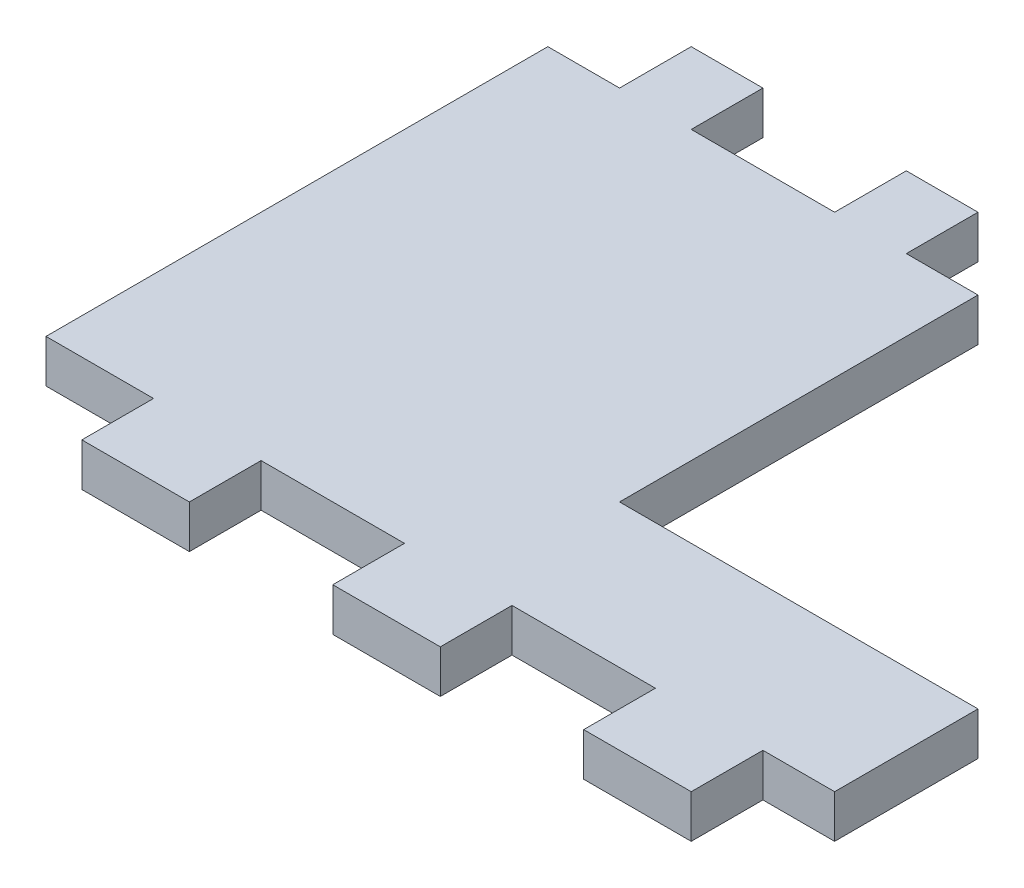
ISO-10303-21;
HEADER;
FILE_DESCRIPTION(('STEP AP214'),'2;1');
FILE_NAME('part.step','',(''),(''),'','','');
FILE_SCHEMA(('AUTOMOTIVE_DESIGN { 1 0 10303 214 1 1 1 1 }'));
ENDSEC;
DATA;
#1=APPLICATION_CONTEXT('core data for automotive mechanical design processes');
#2=APPLICATION_PROTOCOL_DEFINITION('international standard','automotive_design',2000,#1);
#3=PRODUCT_CONTEXT('',#1,'mechanical');
#4=PRODUCT('Part','Part','',(#3));
#5=PRODUCT_RELATED_PRODUCT_CATEGORY('part','',(#4));
#6=PRODUCT_DEFINITION_FORMATION('','',#4);
#7=PRODUCT_DEFINITION_CONTEXT('part definition',#1,'design');
#8=PRODUCT_DEFINITION('design','',#6,#7);
#9=PRODUCT_DEFINITION_SHAPE('','',#8);
#10=(LENGTH_UNIT() NAMED_UNIT(*) SI_UNIT(.MILLI.,.METRE.));
#11=(NAMED_UNIT(*) PLANE_ANGLE_UNIT() SI_UNIT($,.RADIAN.));
#12=(NAMED_UNIT(*) SI_UNIT($,.STERADIAN.) SOLID_ANGLE_UNIT());
#13=UNCERTAINTY_MEASURE_WITH_UNIT(LENGTH_MEASURE(1.E-05),#10,'distance_accuracy_value','');
#14=(GEOMETRIC_REPRESENTATION_CONTEXT(3) GLOBAL_UNCERTAINTY_ASSIGNED_CONTEXT((#13)) GLOBAL_UNIT_ASSIGNED_CONTEXT((#10,
#11,#12)) REPRESENTATION_CONTEXT('',''));
#15=CARTESIAN_POINT('',(0.,0.,0.));
#16=DIRECTION('',(0.,0.,1.));
#17=DIRECTION('',(1.,0.,0.));
#18=AXIS2_PLACEMENT_3D('',#15,#16,#17);
#19=CARTESIAN_POINT('',(-48.4605767520481,3.,-3.11327042125784));
#20=DIRECTION('',(-1.,0.,0.));
#21=DIRECTION('',(0.,0.,1.));
#22=AXIS2_PLACEMENT_3D('',#19,#20,#21);
#23=PLANE('',#22);
#24=DIRECTION('',(0.,0.,-1.));
#25=VECTOR('',#24,1.);
#26=CARTESIAN_POINT('',(-48.4605767520481,0.,-3.11327042125784));
#27=LINE('',#26,#25);
#28=CARTESIAN_POINT('',(-48.4605767520481,0.,1.88672957874216));
#29=VERTEX_POINT('',#28);
#30=CARTESIAN_POINT('',(-48.4605767520481,0.,-3.11327042125784));
#31=VERTEX_POINT('',#30);
#32=EDGE_CURVE('E238',#29,#31,#27,.T.);
#33=ORIENTED_EDGE('',*,*,#32,.T.);
#34=DIRECTION('',(0.,-1.,0.));
#35=VECTOR('',#34,1.);
#36=CARTESIAN_POINT('',(-48.4605767520481,3.,-3.11327042125784));
#37=LINE('',#36,#35);
#38=CARTESIAN_POINT('',(-48.4605767520481,3.,-3.11327042125784));
#39=VERTEX_POINT('',#38);
#40=EDGE_CURVE('E11',#39,#31,#37,.T.);
#41=ORIENTED_EDGE('',*,*,#40,.F.);
#42=DIRECTION('',(0.,0.,-1.));
#43=VECTOR('',#42,1.);
#44=CARTESIAN_POINT('',(-48.4605767520481,3.,-3.11327042125784));
#45=LINE('',#44,#43);
#46=CARTESIAN_POINT('',(-48.4605767520481,3.,1.88672957874216));
#47=VERTEX_POINT('',#46);
#48=EDGE_CURVE('E288',#47,#39,#45,.T.);
#49=ORIENTED_EDGE('',*,*,#48,.F.);
#50=DIRECTION('',(0.,-1.,0.));
#51=VECTOR('',#50,1.);
#52=CARTESIAN_POINT('',(-48.4605767520481,3.,1.88672957874216));
#53=LINE('',#52,#51);
#54=EDGE_CURVE('E234',#47,#29,#53,.T.);
#55=ORIENTED_EDGE('',*,*,#54,.T.);
#56=EDGE_LOOP('',(#33,#41,#49,#55));
#57=FACE_BOUND('',#56,.T.);
#58=ADVANCED_FACE('F34',(#57),#23,.F.);
#59=CARTESIAN_POINT('',(-48.4605767520481,3.,-3.11327042125784));
#60=DIRECTION('',(0.,0.,1.));
#61=DIRECTION('',(1.,0.,0.));
#62=AXIS2_PLACEMENT_3D('',#59,#60,#61);
#63=PLANE('',#62);
#64=DIRECTION('',(-1.,0.,0.));
#65=VECTOR('',#64,1.);
#66=CARTESIAN_POINT('',(-48.4605767520481,0.,-3.11327042125784));
#67=LINE('',#66,#65);
#68=CARTESIAN_POINT('',(-53.4605767520481,0.,-3.11327042125783));
#69=VERTEX_POINT('',#68);
#70=EDGE_CURVE('E241',#31,#69,#67,.T.);
#71=ORIENTED_EDGE('',*,*,#70,.T.);
#72=DIRECTION('',(0.,-1.,0.));
#73=VECTOR('',#72,1.);
#74=CARTESIAN_POINT('',(-53.4605767520481,3.,-3.11327042125783));
#75=LINE('',#74,#73);
#76=CARTESIAN_POINT('',(-53.4605767520481,3.,-3.11327042125783));
#77=VERTEX_POINT('',#76);
#78=EDGE_CURVE('E42',#77,#69,#75,.T.);
#79=ORIENTED_EDGE('',*,*,#78,.F.);
#80=DIRECTION('',(-1.,0.,0.));
#81=VECTOR('',#80,1.);
#82=CARTESIAN_POINT('',(-48.4605767520481,3.,-3.11327042125784));
#83=LINE('',#82,#81);
#84=EDGE_CURVE('E147',#39,#77,#83,.T.);
#85=ORIENTED_EDGE('',*,*,#84,.F.);
#86=ORIENTED_EDGE('',*,*,#40,.T.);
#87=EDGE_LOOP('',(#71,#79,#85,#86));
#88=FACE_BOUND('',#87,.T.);
#89=ADVANCED_FACE('F436',(#88),#63,.F.);
#90=CARTESIAN_POINT('',(-53.4605767520481,3.,1.88672957874217));
#91=DIRECTION('',(1.,0.,0.));
#92=DIRECTION('',(0.,0.,-1.));
#93=AXIS2_PLACEMENT_3D('',#90,#91,#92);
#94=PLANE('',#93);
#95=DIRECTION('',(0.,0.,1.));
#96=VECTOR('',#95,1.);
#97=CARTESIAN_POINT('',(-53.4605767520481,0.,1.88672957874217));
#98=LINE('',#97,#96);
#99=CARTESIAN_POINT('',(-53.4605767520481,0.,1.88672957874217));
#100=VERTEX_POINT('',#99);
#101=EDGE_CURVE('E243',#69,#100,#98,.T.);
#102=ORIENTED_EDGE('',*,*,#101,.T.);
#103=DIRECTION('',(0.,-1.,0.));
#104=VECTOR('',#103,1.);
#105=CARTESIAN_POINT('',(-53.4605767520481,3.,1.88672957874217));
#106=LINE('',#105,#104);
#107=CARTESIAN_POINT('',(-53.4605767520481,3.,1.88672957874217));
#108=VERTEX_POINT('',#107);
#109=EDGE_CURVE('E349',#108,#100,#106,.T.);
#110=ORIENTED_EDGE('',*,*,#109,.F.);
#111=DIRECTION('',(0.,0.,1.));
#112=VECTOR('',#111,1.);
#113=CARTESIAN_POINT('',(-53.4605767520481,3.,1.88672957874217));
#114=LINE('',#113,#112);
#115=EDGE_CURVE('E357',#77,#108,#114,.T.);
#116=ORIENTED_EDGE('',*,*,#115,.F.);
#117=ORIENTED_EDGE('',*,*,#78,.T.);
#118=EDGE_LOOP('',(#102,#110,#116,#117));
#119=FACE_BOUND('',#118,.T.);
#120=ADVANCED_FACE('F355',(#119),#94,.F.);
#121=CARTESIAN_POINT('',(-63.4605767520481,3.,1.88672957874217));
#122=DIRECTION('',(0.,0.,1.));
#123=DIRECTION('',(1.,0.,0.));
#124=AXIS2_PLACEMENT_3D('',#121,#122,#123);
#125=PLANE('',#124);
#126=DIRECTION('',(-1.,0.,0.));
#127=VECTOR('',#126,1.);
#128=CARTESIAN_POINT('',(-63.4605767520481,0.,1.88672957874217));
#129=LINE('',#128,#127);
#130=CARTESIAN_POINT('',(-63.4605767520481,0.,1.88672957874217));
#131=VERTEX_POINT('',#130);
#132=EDGE_CURVE('E245',#100,#131,#129,.T.);
#133=ORIENTED_EDGE('',*,*,#132,.T.);
#134=DIRECTION('',(0.,-1.,0.));
#135=VECTOR('',#134,1.);
#136=CARTESIAN_POINT('',(-63.4605767520481,3.,1.88672957874217));
#137=LINE('',#136,#135);
#138=CARTESIAN_POINT('',(-63.4605767520481,3.,1.88672957874217));
#139=VERTEX_POINT('',#138);
#140=EDGE_CURVE('E346',#139,#131,#137,.T.);
#141=ORIENTED_EDGE('',*,*,#140,.F.);
#142=DIRECTION('',(-1.,0.,0.));
#143=VECTOR('',#142,1.);
#144=CARTESIAN_POINT('',(-63.4605767520481,3.,1.88672957874217));
#145=LINE('',#144,#143);
#146=EDGE_CURVE('E375',#108,#139,#145,.T.);
#147=ORIENTED_EDGE('',*,*,#146,.F.);
#148=ORIENTED_EDGE('',*,*,#109,.T.);
#149=EDGE_LOOP('',(#133,#141,#147,#148));
#150=FACE_BOUND('',#149,.T.);
#151=ADVANCED_FACE('F366',(#150),#125,.F.);
#152=CARTESIAN_POINT('',(-63.4605767520481,3.,-3.11327042125783));
#153=DIRECTION('',(-1.,0.,0.));
#154=DIRECTION('',(0.,0.,1.));
#155=AXIS2_PLACEMENT_3D('',#152,#153,#154);
#156=PLANE('',#155);
#157=DIRECTION('',(0.,0.,-1.));
#158=VECTOR('',#157,1.);
#159=CARTESIAN_POINT('',(-63.4605767520481,0.,-3.11327042125783));
#160=LINE('',#159,#158);
#161=CARTESIAN_POINT('',(-63.4605767520481,0.,-3.11327042125783));
#162=VERTEX_POINT('',#161);
#163=EDGE_CURVE('E247',#131,#162,#160,.T.);
#164=ORIENTED_EDGE('',*,*,#163,.T.);
#165=DIRECTION('',(0.,-1.,0.));
#166=VECTOR('',#165,1.);
#167=CARTESIAN_POINT('',(-63.4605767520481,3.,-3.11327042125783));
#168=LINE('',#167,#166);
#169=CARTESIAN_POINT('',(-63.4605767520481,3.,-3.11327042125783));
#170=VERTEX_POINT('',#169);
#171=EDGE_CURVE('E343',#170,#162,#168,.T.);
#172=ORIENTED_EDGE('',*,*,#171,.F.);
#173=DIRECTION('',(0.,0.,-1.));
#174=VECTOR('',#173,1.);
#175=CARTESIAN_POINT('',(-63.4605767520481,3.,-3.11327042125783));
#176=LINE('',#175,#174);
#177=EDGE_CURVE('E372',#139,#170,#176,.T.);
#178=ORIENTED_EDGE('',*,*,#177,.F.);
#179=ORIENTED_EDGE('',*,*,#140,.T.);
#180=EDGE_LOOP('',(#164,#172,#178,#179));
#181=FACE_BOUND('',#180,.T.);
#182=ADVANCED_FACE('F370',(#181),#156,.F.);
#183=CARTESIAN_POINT('',(-68.4605767520481,3.,-3.11327042125783));
#184=DIRECTION('',(0.,0.,1.));
#185=DIRECTION('',(1.,0.,0.));
#186=AXIS2_PLACEMENT_3D('',#183,#184,#185);
#187=PLANE('',#186);
#188=DIRECTION('',(-1.,0.,0.));
#189=VECTOR('',#188,1.);
#190=CARTESIAN_POINT('',(-68.4605767520481,0.,-3.11327042125783));
#191=LINE('',#190,#189);
#192=CARTESIAN_POINT('',(-68.4605767520481,0.,-3.11327042125783));
#193=VERTEX_POINT('',#192);
#194=EDGE_CURVE('E249',#162,#193,#191,.T.);
#195=ORIENTED_EDGE('',*,*,#194,.T.);
#196=DIRECTION('',(0.,-1.,0.));
#197=VECTOR('',#196,1.);
#198=CARTESIAN_POINT('',(-68.4605767520481,3.,-3.11327042125783));
#199=LINE('',#198,#197);
#200=CARTESIAN_POINT('',(-68.4605767520481,3.,-3.11327042125783));
#201=VERTEX_POINT('',#200);
#202=EDGE_CURVE('E340',#201,#193,#199,.T.);
#203=ORIENTED_EDGE('',*,*,#202,.F.);
#204=DIRECTION('',(-1.,0.,0.));
#205=VECTOR('',#204,1.);
#206=CARTESIAN_POINT('',(-68.4605767520481,3.,-3.11327042125783));
#207=LINE('',#206,#205);
#208=EDGE_CURVE('E374',#170,#201,#207,.T.);
#209=ORIENTED_EDGE('',*,*,#208,.F.);
#210=ORIENTED_EDGE('',*,*,#171,.T.);
#211=EDGE_LOOP('',(#195,#203,#209,#210));
#212=FACE_BOUND('',#211,.T.);
#213=ADVANCED_FACE('F449',(#212),#187,.F.);
#214=CARTESIAN_POINT('',(-68.4605767520481,3.,1.88672957874216));
#215=DIRECTION('',(1.,0.,0.));
#216=DIRECTION('',(0.,0.,-1.));
#217=AXIS2_PLACEMENT_3D('',#214,#215,#216);
#218=PLANE('',#217);
#219=DIRECTION('',(0.,0.,1.));
#220=VECTOR('',#219,1.);
#221=CARTESIAN_POINT('',(-68.4605767520481,0.,1.88672957874216));
#222=LINE('',#221,#220);
#223=CARTESIAN_POINT('',(-68.4605767520481,0.,1.88672957874216));
#224=VERTEX_POINT('',#223);
#225=EDGE_CURVE('E251',#193,#224,#222,.T.);
#226=ORIENTED_EDGE('',*,*,#225,.T.);
#227=DIRECTION('',(0.,-1.,0.));
#228=VECTOR('',#227,1.);
#229=CARTESIAN_POINT('',(-68.4605767520481,3.,1.88672957874216));
#230=LINE('',#229,#228);
#231=CARTESIAN_POINT('',(-68.4605767520481,3.,1.88672957874216));
#232=VERTEX_POINT('',#231);
#233=EDGE_CURVE('E337',#232,#224,#230,.T.);
#234=ORIENTED_EDGE('',*,*,#233,.F.);
#235=DIRECTION('',(0.,0.,1.));
#236=VECTOR('',#235,1.);
#237=CARTESIAN_POINT('',(-68.4605767520481,3.,1.88672957874216));
#238=LINE('',#237,#236);
#239=EDGE_CURVE('E377',#201,#232,#238,.T.);
#240=ORIENTED_EDGE('',*,*,#239,.F.);
#241=ORIENTED_EDGE('',*,*,#202,.T.);
#242=EDGE_LOOP('',(#226,#234,#240,#241));
#243=FACE_BOUND('',#242,.T.);
#244=ADVANCED_FACE('F452',(#243),#218,.F.);
#245=CARTESIAN_POINT('',(-68.4605767520481,3.,1.88672957874216));
#246=DIRECTION('',(0.,0.,1.));
#247=DIRECTION('',(1.,0.,0.));
#248=AXIS2_PLACEMENT_3D('',#245,#246,#247);
#249=PLANE('',#248);
#250=DIRECTION('',(-1.,0.,0.));
#251=VECTOR('',#250,1.);
#252=CARTESIAN_POINT('',(-68.4605767520481,0.,1.88672957874216));
#253=LINE('',#252,#251);
#254=CARTESIAN_POINT('',(-73.4605767520481,0.,1.88672957874216));
#255=VERTEX_POINT('',#254);
#256=EDGE_CURVE('E253',#224,#255,#253,.T.);
#257=ORIENTED_EDGE('',*,*,#256,.T.);
#258=DIRECTION('',(0.,-1.,0.));
#259=VECTOR('',#258,1.);
#260=CARTESIAN_POINT('',(-73.4605767520481,3.,1.88672957874216));
#261=LINE('',#260,#259);
#262=CARTESIAN_POINT('',(-73.4605767520481,3.,1.88672957874216));
#263=VERTEX_POINT('',#262);
#264=EDGE_CURVE('E334',#263,#255,#261,.T.);
#265=ORIENTED_EDGE('',*,*,#264,.F.);
#266=DIRECTION('',(-1.,0.,0.));
#267=VECTOR('',#266,1.);
#268=CARTESIAN_POINT('',(-68.4605767520481,3.,1.88672957874216));
#269=LINE('',#268,#267);
#270=EDGE_CURVE('E383',#232,#263,#269,.T.);
#271=ORIENTED_EDGE('',*,*,#270,.F.);
#272=ORIENTED_EDGE('',*,*,#233,.T.);
#273=EDGE_LOOP('',(#257,#265,#271,#272));
#274=FACE_BOUND('',#273,.T.);
#275=ADVANCED_FACE('F456',(#274),#249,.F.);
#276=CARTESIAN_POINT('',(-73.4605767520481,3.,36.8867295787422));
#277=DIRECTION('',(1.,0.,0.));
#278=DIRECTION('',(0.,0.,-1.));
#279=AXIS2_PLACEMENT_3D('',#276,#277,#278);
#280=PLANE('',#279);
#281=DIRECTION('',(0.,0.,1.));
#282=VECTOR('',#281,1.);
#283=CARTESIAN_POINT('',(-73.4605767520481,0.,36.8867295787422));
#284=LINE('',#283,#282);
#285=CARTESIAN_POINT('',(-73.4605767520481,0.,36.8867295787422));
#286=VERTEX_POINT('',#285);
#287=EDGE_CURVE('E255',#255,#286,#284,.T.);
#288=ORIENTED_EDGE('',*,*,#287,.T.);
#289=DIRECTION('',(0.,-1.,0.));
#290=VECTOR('',#289,1.);
#291=CARTESIAN_POINT('',(-73.4605767520481,3.,36.8867295787422));
#292=LINE('',#291,#290);
#293=CARTESIAN_POINT('',(-73.4605767520481,3.,36.8867295787422));
#294=VERTEX_POINT('',#293);
#295=EDGE_CURVE('E331',#294,#286,#292,.T.);
#296=ORIENTED_EDGE('',*,*,#295,.F.);
#297=DIRECTION('',(0.,0.,1.));
#298=VECTOR('',#297,1.);
#299=CARTESIAN_POINT('',(-73.4605767520481,3.,36.8867295787422));
#300=LINE('',#299,#298);
#301=EDGE_CURVE('E385',#263,#294,#300,.T.);
#302=ORIENTED_EDGE('',*,*,#301,.F.);
#303=ORIENTED_EDGE('',*,*,#264,.T.);
#304=EDGE_LOOP('',(#288,#296,#302,#303));
#305=FACE_BOUND('',#304,.T.);
#306=ADVANCED_FACE('F460',(#305),#280,.F.);
#307=CARTESIAN_POINT('',(-65.9605767520481,3.,36.8867295787422));
#308=DIRECTION('',(0.,0.,-1.));
#309=DIRECTION('',(-1.,0.,0.));
#310=AXIS2_PLACEMENT_3D('',#307,#308,#309);
#311=PLANE('',#310);
#312=DIRECTION('',(1.,0.,0.));
#313=VECTOR('',#312,1.);
#314=CARTESIAN_POINT('',(-65.9605767520481,0.,36.8867295787422));
#315=LINE('',#314,#313);
#316=CARTESIAN_POINT('',(-65.9605767520481,0.,36.8867295787422));
#317=VERTEX_POINT('',#316);
#318=EDGE_CURVE('E257',#286,#317,#315,.T.);
#319=ORIENTED_EDGE('',*,*,#318,.T.);
#320=DIRECTION('',(0.,-1.,0.));
#321=VECTOR('',#320,1.);
#322=CARTESIAN_POINT('',(-65.9605767520481,3.,36.8867295787422));
#323=LINE('',#322,#321);
#324=CARTESIAN_POINT('',(-65.9605767520481,3.,36.8867295787422));
#325=VERTEX_POINT('',#324);
#326=EDGE_CURVE('E328',#325,#317,#323,.T.);
#327=ORIENTED_EDGE('',*,*,#326,.F.);
#328=DIRECTION('',(1.,0.,0.));
#329=VECTOR('',#328,1.);
#330=CARTESIAN_POINT('',(-65.9605767520481,3.,36.8867295787422));
#331=LINE('',#330,#329);
#332=EDGE_CURVE('E387',#294,#325,#331,.T.);
#333=ORIENTED_EDGE('',*,*,#332,.F.);
#334=ORIENTED_EDGE('',*,*,#295,.T.);
#335=EDGE_LOOP('',(#319,#327,#333,#334));
#336=FACE_BOUND('',#335,.T.);
#337=ADVANCED_FACE('F464',(#336),#311,.F.);
#338=CARTESIAN_POINT('',(-65.9605767520481,3.,41.8867295787422));
#339=DIRECTION('',(1.,0.,0.));
#340=DIRECTION('',(0.,0.,-1.));
#341=AXIS2_PLACEMENT_3D('',#338,#339,#340);
#342=PLANE('',#341);
#343=DIRECTION('',(0.,0.,1.));
#344=VECTOR('',#343,1.);
#345=CARTESIAN_POINT('',(-65.9605767520481,0.,41.8867295787422));
#346=LINE('',#345,#344);
#347=CARTESIAN_POINT('',(-65.9605767520481,0.,41.8867295787422));
#348=VERTEX_POINT('',#347);
#349=EDGE_CURVE('E259',#317,#348,#346,.T.);
#350=ORIENTED_EDGE('',*,*,#349,.T.);
#351=DIRECTION('',(0.,-1.,0.));
#352=VECTOR('',#351,1.);
#353=CARTESIAN_POINT('',(-65.9605767520481,3.,41.8867295787422));
#354=LINE('',#353,#352);
#355=CARTESIAN_POINT('',(-65.9605767520481,3.,41.8867295787422));
#356=VERTEX_POINT('',#355);
#357=EDGE_CURVE('E325',#356,#348,#354,.T.);
#358=ORIENTED_EDGE('',*,*,#357,.F.);
#359=DIRECTION('',(0.,0.,1.));
#360=VECTOR('',#359,1.);
#361=CARTESIAN_POINT('',(-65.9605767520481,3.,41.8867295787422));
#362=LINE('',#361,#360);
#363=EDGE_CURVE('E389',#325,#356,#362,.T.);
#364=ORIENTED_EDGE('',*,*,#363,.F.);
#365=ORIENTED_EDGE('',*,*,#326,.T.);
#366=EDGE_LOOP('',(#350,#358,#364,#365));
#367=FACE_BOUND('',#366,.T.);
#368=ADVANCED_FACE('F468',(#367),#342,.F.);
#369=CARTESIAN_POINT('',(-58.4605767520481,3.,41.8867295787422));
#370=DIRECTION('',(0.,0.,-1.));
#371=DIRECTION('',(-1.,0.,0.));
#372=AXIS2_PLACEMENT_3D('',#369,#370,#371);
#373=PLANE('',#372);
#374=DIRECTION('',(1.,0.,0.));
#375=VECTOR('',#374,1.);
#376=CARTESIAN_POINT('',(-58.4605767520481,0.,41.8867295787422));
#377=LINE('',#376,#375);
#378=CARTESIAN_POINT('',(-58.4605767520481,0.,41.8867295787422));
#379=VERTEX_POINT('',#378);
#380=EDGE_CURVE('E261',#348,#379,#377,.T.);
#381=ORIENTED_EDGE('',*,*,#380,.T.);
#382=DIRECTION('',(0.,-1.,0.));
#383=VECTOR('',#382,1.);
#384=CARTESIAN_POINT('',(-58.4605767520481,3.,41.8867295787422));
#385=LINE('',#384,#383);
#386=CARTESIAN_POINT('',(-58.4605767520481,3.,41.8867295787422));
#387=VERTEX_POINT('',#386);
#388=EDGE_CURVE('E322',#387,#379,#385,.T.);
#389=ORIENTED_EDGE('',*,*,#388,.F.);
#390=DIRECTION('',(1.,0.,0.));
#391=VECTOR('',#390,1.);
#392=CARTESIAN_POINT('',(-58.4605767520481,3.,41.8867295787422));
#393=LINE('',#392,#391);
#394=EDGE_CURVE('E391',#356,#387,#393,.T.);
#395=ORIENTED_EDGE('',*,*,#394,.F.);
#396=ORIENTED_EDGE('',*,*,#357,.T.);
#397=EDGE_LOOP('',(#381,#389,#395,#396));
#398=FACE_BOUND('',#397,.T.);
#399=ADVANCED_FACE('F472',(#398),#373,.F.);
#400=CARTESIAN_POINT('',(-58.4605767520481,3.,41.8867295787422));
#401=DIRECTION('',(-1.,0.,0.));
#402=DIRECTION('',(0.,0.,1.));
#403=AXIS2_PLACEMENT_3D('',#400,#401,#402);
#404=PLANE('',#403);
#405=DIRECTION('',(0.,0.,-1.));
#406=VECTOR('',#405,1.);
#407=CARTESIAN_POINT('',(-58.4605767520481,0.,41.8867295787422));
#408=LINE('',#407,#406);
#409=CARTESIAN_POINT('',(-58.4605767520481,0.,36.8867295787422));
#410=VERTEX_POINT('',#409);
#411=EDGE_CURVE('E263',#379,#410,#408,.T.);
#412=ORIENTED_EDGE('',*,*,#411,.T.);
#413=DIRECTION('',(0.,-1.,0.));
#414=VECTOR('',#413,1.);
#415=CARTESIAN_POINT('',(-58.4605767520481,3.,36.8867295787422));
#416=LINE('',#415,#414);
#417=CARTESIAN_POINT('',(-58.4605767520481,3.,36.8867295787422));
#418=VERTEX_POINT('',#417);
#419=EDGE_CURVE('E319',#418,#410,#416,.T.);
#420=ORIENTED_EDGE('',*,*,#419,.F.);
#421=DIRECTION('',(0.,0.,-1.));
#422=VECTOR('',#421,1.);
#423=CARTESIAN_POINT('',(-58.4605767520481,3.,41.8867295787422));
#424=LINE('',#423,#422);
#425=EDGE_CURVE('E393',#387,#418,#424,.T.);
#426=ORIENTED_EDGE('',*,*,#425,.F.);
#427=ORIENTED_EDGE('',*,*,#388,.T.);
#428=EDGE_LOOP('',(#412,#420,#426,#427));
#429=FACE_BOUND('',#428,.T.);
#430=ADVANCED_FACE('F476',(#429),#404,.F.);
#431=CARTESIAN_POINT('',(-48.4605767520481,3.,36.8867295787422));
#432=DIRECTION('',(0.,0.,-1.));
#433=DIRECTION('',(-1.,0.,0.));
#434=AXIS2_PLACEMENT_3D('',#431,#432,#433);
#435=PLANE('',#434);
#436=DIRECTION('',(1.,0.,0.));
#437=VECTOR('',#436,1.);
#438=CARTESIAN_POINT('',(-48.4605767520481,0.,36.8867295787422));
#439=LINE('',#438,#437);
#440=CARTESIAN_POINT('',(-48.4605767520481,0.,36.8867295787422));
#441=VERTEX_POINT('',#440);
#442=EDGE_CURVE('E265',#410,#441,#439,.T.);
#443=ORIENTED_EDGE('',*,*,#442,.T.);
#444=DIRECTION('',(0.,-1.,0.));
#445=VECTOR('',#444,1.);
#446=CARTESIAN_POINT('',(-48.4605767520481,3.,36.8867295787422));
#447=LINE('',#446,#445);
#448=CARTESIAN_POINT('',(-48.4605767520481,3.,36.8867295787422));
#449=VERTEX_POINT('',#448);
#450=EDGE_CURVE('E316',#449,#441,#447,.T.);
#451=ORIENTED_EDGE('',*,*,#450,.F.);
#452=DIRECTION('',(1.,0.,0.));
#453=VECTOR('',#452,1.);
#454=CARTESIAN_POINT('',(-48.4605767520481,3.,36.8867295787422));
#455=LINE('',#454,#453);
#456=EDGE_CURVE('E395',#418,#449,#455,.T.);
#457=ORIENTED_EDGE('',*,*,#456,.F.);
#458=ORIENTED_EDGE('',*,*,#419,.T.);
#459=EDGE_LOOP('',(#443,#451,#457,#458));
#460=FACE_BOUND('',#459,.T.);
#461=ADVANCED_FACE('F480',(#460),#435,.F.);
#462=CARTESIAN_POINT('',(-48.4605767520481,3.,41.8867295787421));
#463=DIRECTION('',(1.,0.,0.));
#464=DIRECTION('',(0.,0.,-1.));
#465=AXIS2_PLACEMENT_3D('',#462,#463,#464);
#466=PLANE('',#465);
#467=DIRECTION('',(0.,0.,1.));
#468=VECTOR('',#467,1.);
#469=CARTESIAN_POINT('',(-48.4605767520481,0.,41.8867295787421));
#470=LINE('',#469,#468);
#471=CARTESIAN_POINT('',(-48.4605767520481,0.,41.8867295787421));
#472=VERTEX_POINT('',#471);
#473=EDGE_CURVE('E267',#441,#472,#470,.T.);
#474=ORIENTED_EDGE('',*,*,#473,.T.);
#475=DIRECTION('',(0.,-1.,0.));
#476=VECTOR('',#475,1.);
#477=CARTESIAN_POINT('',(-48.4605767520481,3.,41.8867295787421));
#478=LINE('',#477,#476);
#479=CARTESIAN_POINT('',(-48.4605767520481,3.,41.8867295787421));
#480=VERTEX_POINT('',#479);
#481=EDGE_CURVE('E313',#480,#472,#478,.T.);
#482=ORIENTED_EDGE('',*,*,#481,.F.);
#483=DIRECTION('',(0.,0.,1.));
#484=VECTOR('',#483,1.);
#485=CARTESIAN_POINT('',(-48.4605767520481,3.,41.8867295787421));
#486=LINE('',#485,#484);
#487=EDGE_CURVE('E397',#449,#480,#486,.T.);
#488=ORIENTED_EDGE('',*,*,#487,.F.);
#489=ORIENTED_EDGE('',*,*,#450,.T.);
#490=EDGE_LOOP('',(#474,#482,#488,#489));
#491=FACE_BOUND('',#490,.T.);
#492=ADVANCED_FACE('F484',(#491),#466,.F.);
#493=CARTESIAN_POINT('',(-40.9605767520481,3.,41.8867295787421));
#494=DIRECTION('',(0.,0.,-1.));
#495=DIRECTION('',(-1.,0.,0.));
#496=AXIS2_PLACEMENT_3D('',#493,#494,#495);
#497=PLANE('',#496);
#498=DIRECTION('',(1.,0.,0.));
#499=VECTOR('',#498,1.);
#500=CARTESIAN_POINT('',(-40.9605767520481,0.,41.8867295787421));
#501=LINE('',#500,#499);
#502=CARTESIAN_POINT('',(-40.9605767520481,0.,41.8867295787421));
#503=VERTEX_POINT('',#502);
#504=EDGE_CURVE('E269',#472,#503,#501,.T.);
#505=ORIENTED_EDGE('',*,*,#504,.T.);
#506=DIRECTION('',(0.,-1.,0.));
#507=VECTOR('',#506,1.);
#508=CARTESIAN_POINT('',(-40.9605767520481,3.,41.8867295787421));
#509=LINE('',#508,#507);
#510=CARTESIAN_POINT('',(-40.9605767520481,3.,41.8867295787421));
#511=VERTEX_POINT('',#510);
#512=EDGE_CURVE('E310',#511,#503,#509,.T.);
#513=ORIENTED_EDGE('',*,*,#512,.F.);
#514=DIRECTION('',(1.,0.,0.));
#515=VECTOR('',#514,1.);
#516=CARTESIAN_POINT('',(-40.9605767520481,3.,41.8867295787421));
#517=LINE('',#516,#515);
#518=EDGE_CURVE('E399',#480,#511,#517,.T.);
#519=ORIENTED_EDGE('',*,*,#518,.F.);
#520=ORIENTED_EDGE('',*,*,#481,.T.);
#521=EDGE_LOOP('',(#505,#513,#519,#520));
#522=FACE_BOUND('',#521,.T.);
#523=ADVANCED_FACE('F488',(#522),#497,.F.);
#524=CARTESIAN_POINT('',(-40.9605767520481,3.,41.8867295787421));
#525=DIRECTION('',(-1.,0.,0.));
#526=DIRECTION('',(0.,0.,1.));
#527=AXIS2_PLACEMENT_3D('',#524,#525,#526);
#528=PLANE('',#527);
#529=DIRECTION('',(0.,0.,-1.));
#530=VECTOR('',#529,1.);
#531=CARTESIAN_POINT('',(-40.9605767520481,0.,41.8867295787421));
#532=LINE('',#531,#530);
#533=CARTESIAN_POINT('',(-40.9605767520481,0.,36.8867295787421));
#534=VERTEX_POINT('',#533);
#535=EDGE_CURVE('E271',#503,#534,#532,.T.);
#536=ORIENTED_EDGE('',*,*,#535,.T.);
#537=DIRECTION('',(0.,-1.,0.));
#538=VECTOR('',#537,1.);
#539=CARTESIAN_POINT('',(-40.9605767520481,3.,36.8867295787421));
#540=LINE('',#539,#538);
#541=CARTESIAN_POINT('',(-40.9605767520481,3.,36.8867295787421));
#542=VERTEX_POINT('',#541);
#543=EDGE_CURVE('E307',#542,#534,#540,.T.);
#544=ORIENTED_EDGE('',*,*,#543,.F.);
#545=DIRECTION('',(0.,0.,-1.));
#546=VECTOR('',#545,1.);
#547=CARTESIAN_POINT('',(-40.9605767520481,3.,41.8867295787421));
#548=LINE('',#547,#546);
#549=EDGE_CURVE('E401',#511,#542,#548,.T.);
#550=ORIENTED_EDGE('',*,*,#549,.F.);
#551=ORIENTED_EDGE('',*,*,#512,.T.);
#552=EDGE_LOOP('',(#536,#544,#550,#551));
#553=FACE_BOUND('',#552,.T.);
#554=ADVANCED_FACE('F492',(#553),#528,.F.);
#555=CARTESIAN_POINT('',(-40.9605767520481,3.,36.8867295787421));
#556=DIRECTION('',(0.,0.,-1.));
#557=DIRECTION('',(-1.,0.,0.));
#558=AXIS2_PLACEMENT_3D('',#555,#556,#557);
#559=PLANE('',#558);
#560=DIRECTION('',(1.,0.,0.));
#561=VECTOR('',#560,1.);
#562=CARTESIAN_POINT('',(-40.9605767520481,0.,36.8867295787421));
#563=LINE('',#562,#561);
#564=CARTESIAN_POINT('',(-30.9605767520481,0.,36.8867295787421));
#565=VERTEX_POINT('',#564);
#566=EDGE_CURVE('E273',#534,#565,#563,.T.);
#567=ORIENTED_EDGE('',*,*,#566,.T.);
#568=DIRECTION('',(0.,-1.,0.));
#569=VECTOR('',#568,1.);
#570=CARTESIAN_POINT('',(-30.9605767520481,3.,36.8867295787421));
#571=LINE('',#570,#569);
#572=CARTESIAN_POINT('',(-30.9605767520481,3.,36.8867295787421));
#573=VERTEX_POINT('',#572);
#574=EDGE_CURVE('E304',#573,#565,#571,.T.);
#575=ORIENTED_EDGE('',*,*,#574,.F.);
#576=DIRECTION('',(1.,0.,0.));
#577=VECTOR('',#576,1.);
#578=CARTESIAN_POINT('',(-40.9605767520481,3.,36.8867295787421));
#579=LINE('',#578,#577);
#580=EDGE_CURVE('E403',#542,#573,#579,.T.);
#581=ORIENTED_EDGE('',*,*,#580,.F.);
#582=ORIENTED_EDGE('',*,*,#543,.T.);
#583=EDGE_LOOP('',(#567,#575,#581,#582));
#584=FACE_BOUND('',#583,.T.);
#585=ADVANCED_FACE('F496',(#584),#559,.F.);
#586=CARTESIAN_POINT('',(-30.9605767520481,3.,36.8867295787421));
#587=DIRECTION('',(1.,0.,0.));
#588=DIRECTION('',(0.,0.,-1.));
#589=AXIS2_PLACEMENT_3D('',#586,#587,#588);
#590=PLANE('',#589);
#591=DIRECTION('',(0.,0.,1.));
#592=VECTOR('',#591,1.);
#593=CARTESIAN_POINT('',(-30.9605767520481,0.,36.8867295787421));
#594=LINE('',#593,#592);
#595=CARTESIAN_POINT('',(-30.9605767520481,0.,41.8867295787421));
#596=VERTEX_POINT('',#595);
#597=EDGE_CURVE('E275',#565,#596,#594,.T.);
#598=ORIENTED_EDGE('',*,*,#597,.T.);
#599=DIRECTION('',(0.,-1.,0.));
#600=VECTOR('',#599,1.);
#601=CARTESIAN_POINT('',(-30.9605767520481,3.,41.8867295787421));
#602=LINE('',#601,#600);
#603=CARTESIAN_POINT('',(-30.9605767520481,3.,41.8867295787421));
#604=VERTEX_POINT('',#603);
#605=EDGE_CURVE('E301',#604,#596,#602,.T.);
#606=ORIENTED_EDGE('',*,*,#605,.F.);
#607=DIRECTION('',(0.,0.,1.));
#608=VECTOR('',#607,1.);
#609=CARTESIAN_POINT('',(-30.9605767520481,3.,36.8867295787421));
#610=LINE('',#609,#608);
#611=EDGE_CURVE('E405',#573,#604,#610,.T.);
#612=ORIENTED_EDGE('',*,*,#611,.F.);
#613=ORIENTED_EDGE('',*,*,#574,.T.);
#614=EDGE_LOOP('',(#598,#606,#612,#613));
#615=FACE_BOUND('',#614,.T.);
#616=ADVANCED_FACE('F500',(#615),#590,.F.);
#617=CARTESIAN_POINT('',(-30.9605767520481,3.,41.8867295787421));
#618=DIRECTION('',(0.,0.,-1.));
#619=DIRECTION('',(-1.,0.,0.));
#620=AXIS2_PLACEMENT_3D('',#617,#618,#619);
#621=PLANE('',#620);
#622=DIRECTION('',(1.,0.,0.));
#623=VECTOR('',#622,1.);
#624=CARTESIAN_POINT('',(-30.9605767520481,0.,41.8867295787421));
#625=LINE('',#624,#623);
#626=CARTESIAN_POINT('',(-23.4605767520481,0.,41.8867295787421));
#627=VERTEX_POINT('',#626);
#628=EDGE_CURVE('E277',#596,#627,#625,.T.);
#629=ORIENTED_EDGE('',*,*,#628,.T.);
#630=DIRECTION('',(0.,-1.,0.));
#631=VECTOR('',#630,1.);
#632=CARTESIAN_POINT('',(-23.4605767520481,3.,41.8867295787421));
#633=LINE('',#632,#631);
#634=CARTESIAN_POINT('',(-23.4605767520481,3.,41.8867295787421));
#635=VERTEX_POINT('',#634);
#636=EDGE_CURVE('E298',#635,#627,#633,.T.);
#637=ORIENTED_EDGE('',*,*,#636,.F.);
#638=DIRECTION('',(1.,0.,0.));
#639=VECTOR('',#638,1.);
#640=CARTESIAN_POINT('',(-30.9605767520481,3.,41.8867295787421));
#641=LINE('',#640,#639);
#642=EDGE_CURVE('E407',#604,#635,#641,.T.);
#643=ORIENTED_EDGE('',*,*,#642,.F.);
#644=ORIENTED_EDGE('',*,*,#605,.T.);
#645=EDGE_LOOP('',(#629,#637,#643,#644));
#646=FACE_BOUND('',#645,.T.);
#647=ADVANCED_FACE('F504',(#646),#621,.F.);
#648=CARTESIAN_POINT('',(-23.4605767520481,3.,41.8867295787421));
#649=DIRECTION('',(-1.,0.,0.));
#650=DIRECTION('',(0.,0.,1.));
#651=AXIS2_PLACEMENT_3D('',#648,#649,#650);
#652=PLANE('',#651);
#653=DIRECTION('',(0.,0.,-1.));
#654=VECTOR('',#653,1.);
#655=CARTESIAN_POINT('',(-23.4605767520481,0.,41.8867295787421));
#656=LINE('',#655,#654);
#657=CARTESIAN_POINT('',(-23.4605767520481,0.,36.8867295787421));
#658=VERTEX_POINT('',#657);
#659=EDGE_CURVE('E279',#627,#658,#656,.T.);
#660=ORIENTED_EDGE('',*,*,#659,.T.);
#661=DIRECTION('',(0.,-1.,0.));
#662=VECTOR('',#661,1.);
#663=CARTESIAN_POINT('',(-23.4605767520481,3.,36.8867295787421));
#664=LINE('',#663,#662);
#665=CARTESIAN_POINT('',(-23.4605767520481,3.,36.8867295787421));
#666=VERTEX_POINT('',#665);
#667=EDGE_CURVE('E295',#666,#658,#664,.T.);
#668=ORIENTED_EDGE('',*,*,#667,.F.);
#669=DIRECTION('',(0.,0.,-1.));
#670=VECTOR('',#669,1.);
#671=CARTESIAN_POINT('',(-23.4605767520481,3.,41.8867295787421));
#672=LINE('',#671,#670);
#673=EDGE_CURVE('E409',#635,#666,#672,.T.);
#674=ORIENTED_EDGE('',*,*,#673,.F.);
#675=ORIENTED_EDGE('',*,*,#636,.T.);
#676=EDGE_LOOP('',(#660,#668,#674,#675));
#677=FACE_BOUND('',#676,.T.);
#678=ADVANCED_FACE('F508',(#677),#652,.F.);
#679=CARTESIAN_POINT('',(-23.4605767520481,3.,36.8867295787421));
#680=DIRECTION('',(0.,0.,-1.));
#681=DIRECTION('',(-1.,0.,0.));
#682=AXIS2_PLACEMENT_3D('',#679,#680,#681);
#683=PLANE('',#682);
#684=DIRECTION('',(1.,0.,0.));
#685=VECTOR('',#684,1.);
#686=CARTESIAN_POINT('',(-23.4605767520481,0.,36.8867295787421));
#687=LINE('',#686,#685);
#688=CARTESIAN_POINT('',(-18.4605767520481,0.,36.8867295787421));
#689=VERTEX_POINT('',#688);
#690=EDGE_CURVE('E281',#658,#689,#687,.T.);
#691=ORIENTED_EDGE('',*,*,#690,.T.);
#692=DIRECTION('',(0.,-1.,0.));
#693=VECTOR('',#692,1.);
#694=CARTESIAN_POINT('',(-18.4605767520481,3.,36.8867295787421));
#695=LINE('',#694,#693);
#696=CARTESIAN_POINT('',(-18.4605767520481,3.,36.8867295787421));
#697=VERTEX_POINT('',#696);
#698=EDGE_CURVE('E292',#697,#689,#695,.T.);
#699=ORIENTED_EDGE('',*,*,#698,.F.);
#700=DIRECTION('',(1.,0.,0.));
#701=VECTOR('',#700,1.);
#702=CARTESIAN_POINT('',(-23.4605767520481,3.,36.8867295787421));
#703=LINE('',#702,#701);
#704=EDGE_CURVE('E411',#666,#697,#703,.T.);
#705=ORIENTED_EDGE('',*,*,#704,.F.);
#706=ORIENTED_EDGE('',*,*,#667,.T.);
#707=EDGE_LOOP('',(#691,#699,#705,#706));
#708=FACE_BOUND('',#707,.T.);
#709=ADVANCED_FACE('F417',(#708),#683,.F.);
#710=CARTESIAN_POINT('',(-18.4605767520481,3.,36.8867295787421));
#711=DIRECTION('',(-1.,0.,0.));
#712=DIRECTION('',(0.,0.,1.));
#713=AXIS2_PLACEMENT_3D('',#710,#711,#712);
#714=PLANE('',#713);
#715=DIRECTION('',(0.,0.,-1.));
#716=VECTOR('',#715,1.);
#717=CARTESIAN_POINT('',(-18.4605767520481,0.,36.8867295787421));
#718=LINE('',#717,#716);
#719=CARTESIAN_POINT('',(-18.4605767520481,0.,26.8867295787422));
#720=VERTEX_POINT('',#719);
#721=EDGE_CURVE('E283',#689,#720,#718,.T.);
#722=ORIENTED_EDGE('',*,*,#721,.T.);
#723=DIRECTION('',(0.,-1.,0.));
#724=VECTOR('',#723,1.);
#725=CARTESIAN_POINT('',(-18.4605767520481,3.,26.8867295787422));
#726=LINE('',#725,#724);
#727=CARTESIAN_POINT('',(-18.4605767520481,3.,26.8867295787422));
#728=VERTEX_POINT('',#727);
#729=EDGE_CURVE('E229',#728,#720,#726,.T.);
#730=ORIENTED_EDGE('',*,*,#729,.F.);
#731=DIRECTION('',(0.,0.,-1.));
#732=VECTOR('',#731,1.);
#733=CARTESIAN_POINT('',(-18.4605767520481,3.,36.8867295787421));
#734=LINE('',#733,#732);
#735=EDGE_CURVE('E220',#697,#728,#734,.T.);
#736=ORIENTED_EDGE('',*,*,#735,.F.);
#737=ORIENTED_EDGE('',*,*,#698,.T.);
#738=EDGE_LOOP('',(#722,#730,#736,#737));
#739=FACE_BOUND('',#738,.T.);
#740=ADVANCED_FACE('F421',(#739),#714,.F.);
#741=CARTESIAN_POINT('',(-18.4605767520481,3.,26.8867295787422));
#742=DIRECTION('',(0.,0.,1.));
#743=DIRECTION('',(1.,0.,0.));
#744=AXIS2_PLACEMENT_3D('',#741,#742,#743);
#745=PLANE('',#744);
#746=DIRECTION('',(-1.,0.,0.));
#747=VECTOR('',#746,1.);
#748=CARTESIAN_POINT('',(-18.4605767520481,0.,26.8867295787422));
#749=LINE('',#748,#747);
#750=CARTESIAN_POINT('',(-43.4605767520481,0.,26.8867295787422));
#751=VERTEX_POINT('',#750);
#752=EDGE_CURVE('E228',#720,#751,#749,.T.);
#753=ORIENTED_EDGE('',*,*,#752,.T.);
#754=DIRECTION('',(0.,-1.,0.));
#755=VECTOR('',#754,1.);
#756=CARTESIAN_POINT('',(-43.4605767520481,3.,26.8867295787422));
#757=LINE('',#756,#755);
#758=CARTESIAN_POINT('',(-43.4605767520481,3.,26.8867295787422));
#759=VERTEX_POINT('',#758);
#760=EDGE_CURVE('E225',#759,#751,#757,.T.);
#761=ORIENTED_EDGE('',*,*,#760,.F.);
#762=DIRECTION('',(-1.,0.,0.));
#763=VECTOR('',#762,1.);
#764=CARTESIAN_POINT('',(-18.4605767520481,3.,26.8867295787422));
#765=LINE('',#764,#763);
#766=EDGE_CURVE('E214',#728,#759,#765,.T.);
#767=ORIENTED_EDGE('',*,*,#766,.F.);
#768=ORIENTED_EDGE('',*,*,#729,.T.);
#769=EDGE_LOOP('',(#753,#761,#767,#768));
#770=FACE_BOUND('',#769,.T.);
#771=ADVANCED_FACE('F226',(#770),#745,.F.);
#772=CARTESIAN_POINT('',(-43.4605767520481,3.,26.8867295787422));
#773=DIRECTION('',(-1.,0.,0.));
#774=DIRECTION('',(0.,0.,1.));
#775=AXIS2_PLACEMENT_3D('',#772,#773,#774);
#776=PLANE('',#775);
#777=DIRECTION('',(0.,0.,-1.));
#778=VECTOR('',#777,1.);
#779=CARTESIAN_POINT('',(-43.4605767520481,0.,26.8867295787422));
#780=LINE('',#779,#778);
#781=CARTESIAN_POINT('',(-43.4605767520481,0.,1.88672957874216));
#782=VERTEX_POINT('',#781);
#783=EDGE_CURVE('E133',#751,#782,#780,.T.);
#784=ORIENTED_EDGE('',*,*,#783,.T.);
#785=DIRECTION('',(0.,-1.,0.));
#786=VECTOR('',#785,1.);
#787=CARTESIAN_POINT('',(-43.4605767520481,3.,1.88672957874216));
#788=LINE('',#787,#786);
#789=CARTESIAN_POINT('',(-43.4605767520481,3.,1.88672957874216));
#790=VERTEX_POINT('',#789);
#791=EDGE_CURVE('E230',#790,#782,#788,.T.);
#792=ORIENTED_EDGE('',*,*,#791,.F.);
#793=DIRECTION('',(0.,0.,-1.));
#794=VECTOR('',#793,1.);
#795=CARTESIAN_POINT('',(-43.4605767520481,3.,26.8867295787422));
#796=LINE('',#795,#794);
#797=EDGE_CURVE('E218',#759,#790,#796,.T.);
#798=ORIENTED_EDGE('',*,*,#797,.F.);
#799=ORIENTED_EDGE('',*,*,#760,.T.);
#800=EDGE_LOOP('',(#784,#792,#798,#799));
#801=FACE_BOUND('',#800,.T.);
#802=ADVANCED_FACE('F232',(#801),#776,.F.);
#803=CARTESIAN_POINT('',(-43.4605767520481,3.,1.88672957874216));
#804=DIRECTION('',(0.,0.,1.));
#805=DIRECTION('',(1.,0.,0.));
#806=AXIS2_PLACEMENT_3D('',#803,#804,#805);
#807=PLANE('',#806);
#808=DIRECTION('',(-1.,0.,0.));
#809=VECTOR('',#808,1.);
#810=CARTESIAN_POINT('',(-43.4605767520481,0.,1.88672957874216));
#811=LINE('',#810,#809);
#812=EDGE_CURVE('E139',#782,#29,#811,.T.);
#813=ORIENTED_EDGE('',*,*,#812,.T.);
#814=ORIENTED_EDGE('',*,*,#54,.F.);
#815=DIRECTION('',(-1.,0.,0.));
#816=VECTOR('',#815,1.);
#817=CARTESIAN_POINT('',(-43.4605767520481,3.,1.88672957874216));
#818=LINE('',#817,#816);
#819=EDGE_CURVE('E50',#790,#47,#818,.T.);
#820=ORIENTED_EDGE('',*,*,#819,.F.);
#821=ORIENTED_EDGE('',*,*,#791,.T.);
#822=EDGE_LOOP('',(#813,#814,#820,#821));
#823=FACE_BOUND('',#822,.T.);
#824=ADVANCED_FACE('F425',(#823),#807,.F.);
#825=CARTESIAN_POINT('',(0.,3.,0.));
#826=DIRECTION('',(0.,-1.,0.));
#827=DIRECTION('',(0.,0.,-1.));
#828=AXIS2_PLACEMENT_3D('',#825,#826,#827);
#829=PLANE('',#828);
#830=ORIENTED_EDGE('',*,*,#48,.T.);
#831=ORIENTED_EDGE('',*,*,#84,.T.);
#832=ORIENTED_EDGE('',*,*,#115,.T.);
#833=ORIENTED_EDGE('',*,*,#146,.T.);
#834=ORIENTED_EDGE('',*,*,#177,.T.);
#835=ORIENTED_EDGE('',*,*,#208,.T.);
#836=ORIENTED_EDGE('',*,*,#239,.T.);
#837=ORIENTED_EDGE('',*,*,#270,.T.);
#838=ORIENTED_EDGE('',*,*,#301,.T.);
#839=ORIENTED_EDGE('',*,*,#332,.T.);
#840=ORIENTED_EDGE('',*,*,#363,.T.);
#841=ORIENTED_EDGE('',*,*,#394,.T.);
#842=ORIENTED_EDGE('',*,*,#425,.T.);
#843=ORIENTED_EDGE('',*,*,#456,.T.);
#844=ORIENTED_EDGE('',*,*,#487,.T.);
#845=ORIENTED_EDGE('',*,*,#518,.T.);
#846=ORIENTED_EDGE('',*,*,#549,.T.);
#847=ORIENTED_EDGE('',*,*,#580,.T.);
#848=ORIENTED_EDGE('',*,*,#611,.T.);
#849=ORIENTED_EDGE('',*,*,#642,.T.);
#850=ORIENTED_EDGE('',*,*,#673,.T.);
#851=ORIENTED_EDGE('',*,*,#704,.T.);
#852=ORIENTED_EDGE('',*,*,#735,.T.);
#853=ORIENTED_EDGE('',*,*,#766,.T.);
#854=ORIENTED_EDGE('',*,*,#797,.T.);
#855=ORIENTED_EDGE('',*,*,#819,.T.);
#856=EDGE_LOOP('',(#830,#831,#832,#833,#834,#835,#836,#837,#838,#839,#840,#841,#842,#843,#844,
#845,#846,#847,#848,#849,#850,#851,#852,#853,#854,#855));
#857=FACE_BOUND('',#856,.T.);
#858=ADVANCED_FACE('F216',(#857),#829,.F.);
#859=CARTESIAN_POINT('',(0.,0.,0.));
#860=DIRECTION('',(0.,-1.,0.));
#861=DIRECTION('',(0.,0.,-1.));
#862=AXIS2_PLACEMENT_3D('',#859,#860,#861);
#863=PLANE('',#862);
#864=ORIENTED_EDGE('',*,*,#32,.F.);
#865=ORIENTED_EDGE('',*,*,#812,.F.);
#866=ORIENTED_EDGE('',*,*,#783,.F.);
#867=ORIENTED_EDGE('',*,*,#752,.F.);
#868=ORIENTED_EDGE('',*,*,#721,.F.);
#869=ORIENTED_EDGE('',*,*,#690,.F.);
#870=ORIENTED_EDGE('',*,*,#659,.F.);
#871=ORIENTED_EDGE('',*,*,#628,.F.);
#872=ORIENTED_EDGE('',*,*,#597,.F.);
#873=ORIENTED_EDGE('',*,*,#566,.F.);
#874=ORIENTED_EDGE('',*,*,#535,.F.);
#875=ORIENTED_EDGE('',*,*,#504,.F.);
#876=ORIENTED_EDGE('',*,*,#473,.F.);
#877=ORIENTED_EDGE('',*,*,#442,.F.);
#878=ORIENTED_EDGE('',*,*,#411,.F.);
#879=ORIENTED_EDGE('',*,*,#380,.F.);
#880=ORIENTED_EDGE('',*,*,#349,.F.);
#881=ORIENTED_EDGE('',*,*,#318,.F.);
#882=ORIENTED_EDGE('',*,*,#287,.F.);
#883=ORIENTED_EDGE('',*,*,#256,.F.);
#884=ORIENTED_EDGE('',*,*,#225,.F.);
#885=ORIENTED_EDGE('',*,*,#194,.F.);
#886=ORIENTED_EDGE('',*,*,#163,.F.);
#887=ORIENTED_EDGE('',*,*,#132,.F.);
#888=ORIENTED_EDGE('',*,*,#101,.F.);
#889=ORIENTED_EDGE('',*,*,#70,.F.);
#890=EDGE_LOOP('',(#864,#865,#866,#867,#868,#869,#870,#871,#872,#873,#874,#875,#876,#877,#878,
#879,#880,#881,#882,#883,#884,#885,#886,#887,#888,#889));
#891=FACE_BOUND('',#890,.T.);
#892=ADVANCED_FACE('F361',(#891),#863,.T.);
#893=CLOSED_SHELL('',(#58,#89,#120,#151,#182,#213,#244,#275,#306,#337,#368,#399,#430,#461,#492,
#523,#554,#585,#616,#647,#678,#709,#740,#771,#802,#824,#858,#892));
#894=MANIFOLD_SOLID_BREP('B2',#893);
#895=ADVANCED_BREP_SHAPE_REPRESENTATION('',(#18,#894),#14);
#896=SHAPE_DEFINITION_REPRESENTATION(#9,#895);
ENDSEC;
END-ISO-10303-21;
